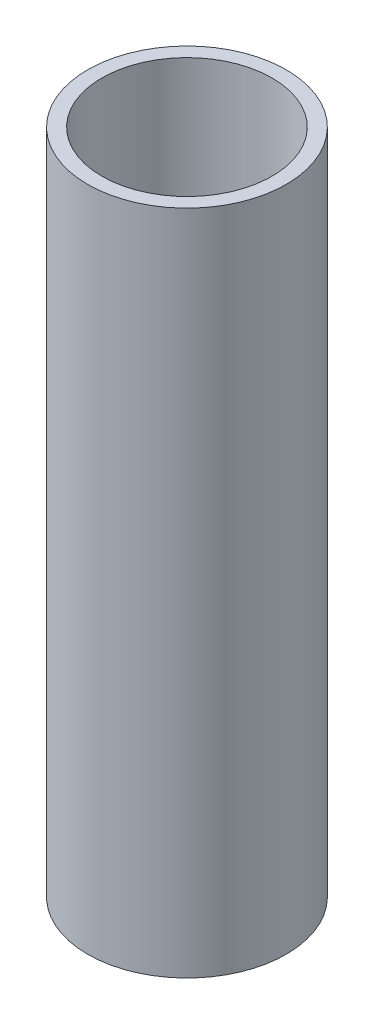
ISO-10303-21;
HEADER;
FILE_DESCRIPTION(('STEP AP214'),'2;1');
FILE_NAME('part.step','',(''),(''),'','','');
FILE_SCHEMA(('AUTOMOTIVE_DESIGN { 1 0 10303 214 1 1 1 1 }'));
ENDSEC;
DATA;
#1=APPLICATION_CONTEXT('core data for automotive mechanical design processes');
#2=APPLICATION_PROTOCOL_DEFINITION('international standard','automotive_design',2000,#1);
#3=PRODUCT_CONTEXT('',#1,'mechanical');
#4=PRODUCT('Part','Part','',(#3));
#5=PRODUCT_RELATED_PRODUCT_CATEGORY('part','',(#4));
#6=PRODUCT_DEFINITION_FORMATION('','',#4);
#7=PRODUCT_DEFINITION_CONTEXT('part definition',#1,'design');
#8=PRODUCT_DEFINITION('design','',#6,#7);
#9=PRODUCT_DEFINITION_SHAPE('','',#8);
#10=(LENGTH_UNIT() NAMED_UNIT(*) SI_UNIT(.MILLI.,.METRE.));
#11=(NAMED_UNIT(*) PLANE_ANGLE_UNIT() SI_UNIT($,.RADIAN.));
#12=(NAMED_UNIT(*) SI_UNIT($,.STERADIAN.) SOLID_ANGLE_UNIT());
#13=UNCERTAINTY_MEASURE_WITH_UNIT(LENGTH_MEASURE(1.E-05),#10,'distance_accuracy_value','');
#14=(GEOMETRIC_REPRESENTATION_CONTEXT(3) GLOBAL_UNCERTAINTY_ASSIGNED_CONTEXT((#13)) GLOBAL_UNIT_ASSIGNED_CONTEXT((#10,
#11,#12)) REPRESENTATION_CONTEXT('',''));
#15=CARTESIAN_POINT('',(0.,0.,0.));
#16=DIRECTION('',(0.,0.,1.));
#17=DIRECTION('',(1.,0.,0.));
#18=AXIS2_PLACEMENT_3D('',#15,#16,#17);
#19=CARTESIAN_POINT('',(0.,298.45,0.));
#20=DIRECTION('',(0.,1.,0.));
#21=DIRECTION('',(0.,0.,1.));
#22=AXIS2_PLACEMENT_3D('',#19,#20,#21);
#23=PLANE('',#22);
#24=CARTESIAN_POINT('',(0.,298.45,0.));
#25=DIRECTION('',(0.,1.,0.));
#26=DIRECTION('',(0.,0.,1.));
#27=AXIS2_PLACEMENT_3D('',#24,#25,#26);
#28=CIRCLE('',#27,44.45);
#29=CARTESIAN_POINT('',(0.,298.45,44.45));
#30=VERTEX_POINT('',#29);
#31=EDGE_CURVE('E10',#30,#30,#28,.T.);
#32=ORIENTED_EDGE('',*,*,#31,.T.);
#33=EDGE_LOOP('',(#32));
#34=FACE_BOUND('',#33,.T.);
#35=CARTESIAN_POINT('',(0.,298.45,0.));
#36=DIRECTION('',(0.,1.,0.));
#37=DIRECTION('',(0.,0.,1.));
#38=AXIS2_PLACEMENT_3D('',#35,#36,#37);
#39=CIRCLE('',#38,38.1);
#40=CARTESIAN_POINT('',(0.,298.45,38.1));
#41=VERTEX_POINT('',#40);
#42=EDGE_CURVE('E42',#41,#41,#39,.T.);
#43=ORIENTED_EDGE('',*,*,#42,.F.);
#44=EDGE_LOOP('',(#43));
#45=FACE_BOUND('',#44,.T.);
#46=ADVANCED_FACE('F31',(#34,#45),#23,.T.);
#47=CARTESIAN_POINT('',(0.,0.,0.));
#48=DIRECTION('',(0.,1.,0.));
#49=DIRECTION('',(0.,0.,1.));
#50=AXIS2_PLACEMENT_3D('',#47,#48,#49);
#51=PLANE('',#50);
#52=CARTESIAN_POINT('',(0.,0.,0.));
#53=DIRECTION('',(0.,1.,0.));
#54=DIRECTION('',(0.,0.,1.));
#55=AXIS2_PLACEMENT_3D('',#52,#53,#54);
#56=CIRCLE('',#55,44.45);
#57=CARTESIAN_POINT('',(0.,0.,44.45));
#58=VERTEX_POINT('',#57);
#59=EDGE_CURVE('E35',#58,#58,#56,.T.);
#60=ORIENTED_EDGE('',*,*,#59,.F.);
#61=EDGE_LOOP('',(#60));
#62=FACE_BOUND('',#61,.T.);
#63=CARTESIAN_POINT('',(0.,0.,0.));
#64=DIRECTION('',(0.,1.,0.));
#65=DIRECTION('',(0.,0.,1.));
#66=AXIS2_PLACEMENT_3D('',#63,#64,#65);
#67=CIRCLE('',#66,38.1);
#68=CARTESIAN_POINT('',(0.,0.,38.1));
#69=VERTEX_POINT('',#68);
#70=EDGE_CURVE('E44',#69,#69,#67,.T.);
#71=ORIENTED_EDGE('',*,*,#70,.T.);
#72=EDGE_LOOP('',(#71));
#73=FACE_BOUND('',#72,.T.);
#74=ADVANCED_FACE('F54',(#62,#73),#51,.F.);
#75=CARTESIAN_POINT('',(0.,298.45,0.));
#76=DIRECTION('',(0.,-1.,0.));
#77=DIRECTION('',(0.,0.,-1.));
#78=AXIS2_PLACEMENT_3D('',#75,#76,#77);
#79=CYLINDRICAL_SURFACE('',#78,44.45);
#80=ORIENTED_EDGE('',*,*,#31,.F.);
#81=EDGE_LOOP('',(#80));
#82=FACE_BOUND('',#81,.T.);
#83=ORIENTED_EDGE('',*,*,#59,.T.);
#84=EDGE_LOOP('',(#83));
#85=FACE_BOUND('',#84,.T.);
#86=ADVANCED_FACE('F33',(#82,#85),#79,.T.);
#87=CARTESIAN_POINT('',(0.,298.45,0.));
#88=DIRECTION('',(0.,-1.,0.));
#89=DIRECTION('',(0.,0.,-1.));
#90=AXIS2_PLACEMENT_3D('',#87,#88,#89);
#91=CYLINDRICAL_SURFACE('',#90,38.1);
#92=ORIENTED_EDGE('',*,*,#42,.T.);
#93=EDGE_LOOP('',(#92));
#94=FACE_BOUND('',#93,.T.);
#95=ORIENTED_EDGE('',*,*,#70,.F.);
#96=EDGE_LOOP('',(#95));
#97=FACE_BOUND('',#96,.T.);
#98=ADVANCED_FACE('F50',(#94,#97),#91,.F.);
#99=CLOSED_SHELL('',(#46,#74,#86,#98));
#100=MANIFOLD_SOLID_BREP('B2',#99);
#101=ADVANCED_BREP_SHAPE_REPRESENTATION('',(#18,#100),#14);
#102=SHAPE_DEFINITION_REPRESENTATION(#9,#101);
ENDSEC;
END-ISO-10303-21;
